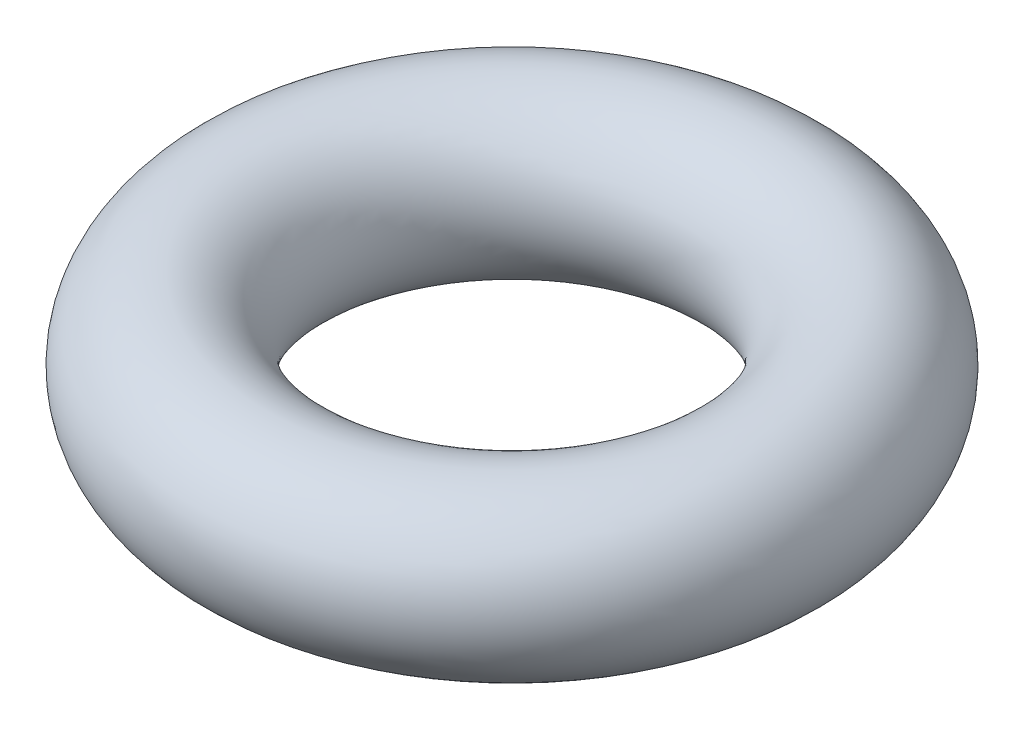
ISO-10303-21;
HEADER;
FILE_DESCRIPTION(('STEP AP214'),'2;1');
FILE_NAME('part.step','',(''),(''),'','','');
FILE_SCHEMA(('AUTOMOTIVE_DESIGN { 1 0 10303 214 1 1 1 1 }'));
ENDSEC;
DATA;
#1=APPLICATION_CONTEXT('core data for automotive mechanical design processes');
#2=APPLICATION_PROTOCOL_DEFINITION('international standard','automotive_design',2000,#1);
#3=PRODUCT_CONTEXT('',#1,'mechanical');
#4=PRODUCT('Part','Part','',(#3));
#5=PRODUCT_RELATED_PRODUCT_CATEGORY('part','',(#4));
#6=PRODUCT_DEFINITION_FORMATION('','',#4);
#7=PRODUCT_DEFINITION_CONTEXT('part definition',#1,'design');
#8=PRODUCT_DEFINITION('design','',#6,#7);
#9=PRODUCT_DEFINITION_SHAPE('','',#8);
#10=(LENGTH_UNIT() NAMED_UNIT(*) SI_UNIT(.MILLI.,.METRE.));
#11=(NAMED_UNIT(*) PLANE_ANGLE_UNIT() SI_UNIT($,.RADIAN.));
#12=(NAMED_UNIT(*) SI_UNIT($,.STERADIAN.) SOLID_ANGLE_UNIT());
#13=UNCERTAINTY_MEASURE_WITH_UNIT(LENGTH_MEASURE(1.E-05),#10,'distance_accuracy_value','');
#14=(GEOMETRIC_REPRESENTATION_CONTEXT(3) GLOBAL_UNCERTAINTY_ASSIGNED_CONTEXT((#13)) GLOBAL_UNIT_ASSIGNED_CONTEXT((#10,
#11,#12)) REPRESENTATION_CONTEXT('',''));
#15=CARTESIAN_POINT('',(0.,0.,0.));
#16=DIRECTION('',(0.,0.,1.));
#17=DIRECTION('',(1.,0.,0.));
#18=AXIS2_PLACEMENT_3D('',#15,#16,#17);
#19=CARTESIAN_POINT('',(0.,0.,0.));
#20=DIRECTION('',(0.,-1.,0.));
#21=DIRECTION('',(1.,0.,0.));
#22=AXIS2_PLACEMENT_3D('',#19,#20,#21);
#23=TOROIDAL_SURFACE('',#22,2.3876,0.79375);
#24=CARTESIAN_POINT('',(3.18135,0.,0.));
#25=VERTEX_POINT('',#24);
#26=VERTEX_LOOP('',#25);
#27=FACE_BOUND('',#26,.T.);
#28=ADVANCED_FACE('F35',(#27),#23,.T.);
#29=CLOSED_SHELL('',(#28));
#30=MANIFOLD_SOLID_BREP('B2',#29);
#31=ADVANCED_BREP_SHAPE_REPRESENTATION('',(#18,#30),#14);
#32=SHAPE_DEFINITION_REPRESENTATION(#9,#31);
ENDSEC;
END-ISO-10303-21;
